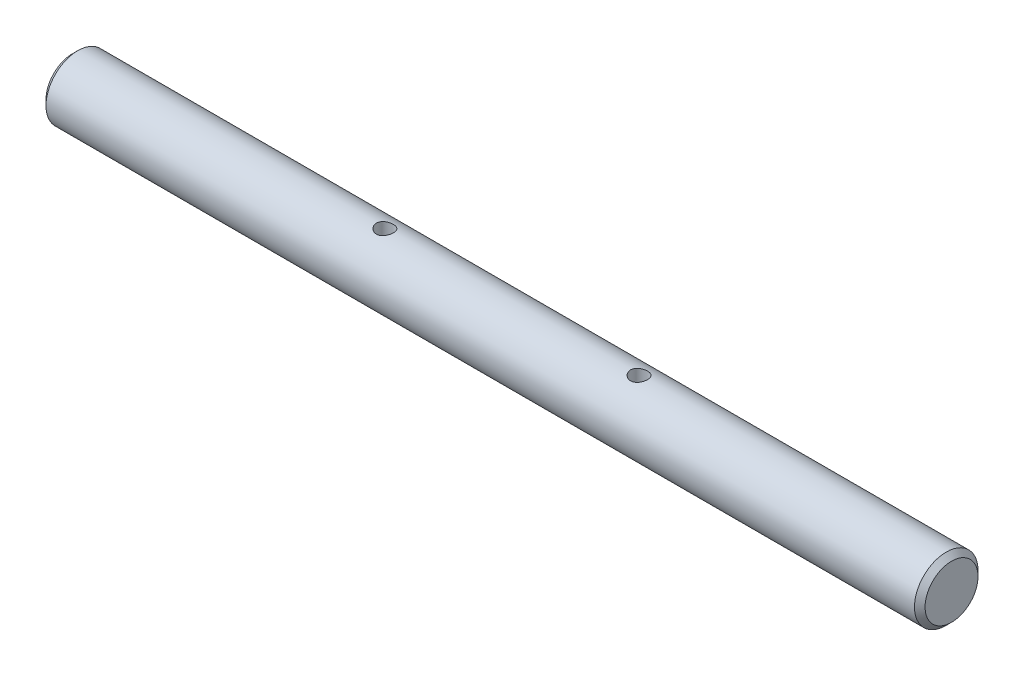
ISO-10303-21;
HEADER;
FILE_DESCRIPTION(('STEP AP214'),'2;1');
FILE_NAME('part.step','',(''),(''),'','','');
FILE_SCHEMA(('AUTOMOTIVE_DESIGN { 1 0 10303 214 1 1 1 1 }'));
ENDSEC;
DATA;
#1=APPLICATION_CONTEXT('core data for automotive mechanical design processes');
#2=APPLICATION_PROTOCOL_DEFINITION('international standard','automotive_design',2000,#1);
#3=PRODUCT_CONTEXT('',#1,'mechanical');
#4=PRODUCT('Part','Part','',(#3));
#5=PRODUCT_RELATED_PRODUCT_CATEGORY('part','',(#4));
#6=PRODUCT_DEFINITION_FORMATION('','',#4);
#7=PRODUCT_DEFINITION_CONTEXT('part definition',#1,'design');
#8=PRODUCT_DEFINITION('design','',#6,#7);
#9=PRODUCT_DEFINITION_SHAPE('','',#8);
#10=(LENGTH_UNIT() NAMED_UNIT(*) SI_UNIT(.MILLI.,.METRE.));
#11=(NAMED_UNIT(*) PLANE_ANGLE_UNIT() SI_UNIT($,.RADIAN.));
#12=(NAMED_UNIT(*) SI_UNIT($,.STERADIAN.) SOLID_ANGLE_UNIT());
#13=UNCERTAINTY_MEASURE_WITH_UNIT(LENGTH_MEASURE(1.E-05),#10,'distance_accuracy_value','');
#14=(GEOMETRIC_REPRESENTATION_CONTEXT(3) GLOBAL_UNCERTAINTY_ASSIGNED_CONTEXT((#13)) GLOBAL_UNIT_ASSIGNED_CONTEXT((#10,
#11,#12)) REPRESENTATION_CONTEXT('',''));
#15=CARTESIAN_POINT('',(0.,0.,0.));
#16=DIRECTION('',(0.,0.,1.));
#17=DIRECTION('',(1.,0.,0.));
#18=AXIS2_PLACEMENT_3D('',#15,#16,#17);
#19=CARTESIAN_POINT('',(-830.,-1.00783655742852E-13,0.));
#20=DIRECTION('',(-1.,0.,0.));
#21=DIRECTION('',(0.,-1.,0.));
#22=AXIS2_PLACEMENT_3D('',#19,#20,#21);
#23=PLANE('',#22);
#24=CARTESIAN_POINT('',(-830.,-1.00787433954253E-13,0.));
#25=DIRECTION('',(-1.,0.,0.));
#26=DIRECTION('',(0.,-1.,0.));
#27=AXIS2_PLACEMENT_3D('',#24,#25,#26);
#28=CIRCLE('',#27,25.);
#29=CARTESIAN_POINT('',(-830.,-25.0000000000001,0.));
#30=VERTEX_POINT('',#29);
#31=EDGE_CURVE('E74',#30,#30,#28,.T.);
#32=ORIENTED_EDGE('',*,*,#31,.T.);
#33=EDGE_LOOP('',(#32));
#34=FACE_BOUND('',#33,.T.);
#35=ADVANCED_FACE('F34',(#34),#23,.T.);
#36=CARTESIAN_POINT('',(0.,0.,0.));
#37=DIRECTION('',(1.,0.,0.));
#38=DIRECTION('',(0.,1.,0.));
#39=AXIS2_PLACEMENT_3D('',#36,#37,#38);
#40=CYLINDRICAL_SURFACE('',#39,29.9999999999999);
#41=CARTESIAN_POINT('',(-543.,29.9999999999999,0.));
#42=CARTESIAN_POINT('',(-543.000007553323,30.0000047930631,0.220578650093214));
#43=CARTESIAN_POINT('',(-542.990876275568,29.9975638847036,0.44107861860417));
#44=CARTESIAN_POINT('',(-542.954447702199,29.9878789889453,0.880527690255317));
#45=CARTESIAN_POINT('',(-542.927148719892,29.9806345555865,1.09947664749168));
#46=CARTESIAN_POINT('',(-542.854602364421,29.9615348022886,1.53421519571786));
#47=CARTESIAN_POINT('',(-542.809350811802,29.9496784086728,1.75000403887752));
#48=CARTESIAN_POINT('',(-542.701263997597,29.921676776969,2.17693220172065));
#49=CARTESIAN_POINT('',(-542.638422244539,29.9055299556574,2.38806977381499));
#50=CARTESIAN_POINT('',(-542.495793979561,29.8694188162847,2.8037988116442));
#51=CARTESIAN_POINT('',(-542.416036263869,29.8494609914199,3.00840073050495));
#52=CARTESIAN_POINT('',(-542.240098822965,29.8062369400105,3.41014305480076));
#53=CARTESIAN_POINT('',(-542.143912947016,29.7829694748769,3.60728063167393));
#54=CARTESIAN_POINT('',(-541.935888798767,29.7337577302114,3.99266560536456));
#55=CARTESIAN_POINT('',(-541.824056438443,29.7078144626914,4.18091632428779));
#56=CARTESIAN_POINT('',(-541.585441439478,29.6539125450335,4.54750659590857));
#57=CARTESIAN_POINT('',(-541.458651962993,29.6259529754042,4.72584156024369));
#58=CARTESIAN_POINT('',(-541.188217349944,29.5681624094275,5.07501132612926));
#59=CARTESIAN_POINT('',(-541.044275915808,29.5383045499936,5.24561225495415));
#60=CARTESIAN_POINT('',(-540.742764740162,29.4780857786046,5.57407686176042));
#61=CARTESIAN_POINT('',(-540.585200850615,29.4477250871441,5.7319459533309));
#62=CARTESIAN_POINT('',(-540.25732528101,29.3873016651862,6.0340910642144));
#63=CARTESIAN_POINT('',(-540.087006844738,29.3572391022952,6.17835978656734));
#64=CARTESIAN_POINT('',(-539.734853919675,29.2982717118577,6.45220041997699));
#65=CARTESIAN_POINT('',(-539.553023756569,29.2693664560243,6.58177780102014));
#66=CARTESIAN_POINT('',(-539.175657778869,29.2130229538655,6.82755230890048));
#67=CARTESIAN_POINT('',(-538.979937028577,29.1856194941862,6.94347370726029));
#68=CARTESIAN_POINT('',(-538.579109813293,29.133667102541,7.15832798081875));
#69=CARTESIAN_POINT('',(-538.374006782175,29.1091171376737,7.25726700947716));
#70=CARTESIAN_POINT('',(-537.955760833145,29.063608069803,7.43742733698708));
#71=CARTESIAN_POINT('',(-537.742617552373,29.0426491291001,7.51864783507406));
#72=CARTESIAN_POINT('',(-537.309834143432,29.0049801777022,7.66268056074757));
#73=CARTESIAN_POINT('',(-537.090194194343,28.9882700500102,7.72549329522533));
#74=CARTESIAN_POINT('',(-536.651066975735,28.9599569294659,7.83095203764014));
#75=CARTESIAN_POINT('',(-536.431688223242,28.9482471463235,7.874021348758));
#76=CARTESIAN_POINT('',(-535.989893894342,28.9297630127214,7.94166516963216));
#77=CARTESIAN_POINT('',(-535.76747840053,28.9229885283002,7.96624018138977));
#78=CARTESIAN_POINT('',(-535.321308138483,28.9145897070142,7.99667132852934));
#79=CARTESIAN_POINT('',(-535.097553584693,28.9129645665067,8.00253038485552));
#80=CARTESIAN_POINT('',(-534.650364903921,28.914914048328,7.99548370789009));
#81=CARTESIAN_POINT('',(-534.426930771811,28.918488586469,7.98257827841278));
#82=CARTESIAN_POINT('',(-533.988322683818,28.9305510183288,7.93874759581903));
#83=CARTESIAN_POINT('',(-533.773093003724,28.9388980708055,7.90833871941785));
#84=CARTESIAN_POINT('',(-533.345966238172,28.9601504503288,7.83015486647988));
#85=CARTESIAN_POINT('',(-533.134070298399,28.9730573101535,7.78237405021198));
#86=CARTESIAN_POINT('',(-532.715204658771,29.0030456839357,7.66985820348015));
#87=CARTESIAN_POINT('',(-532.50823348395,29.0201259302454,7.60512832079342));
#88=CARTESIAN_POINT('',(-532.100449141454,29.0579792646432,7.45919034864228));
#89=CARTESIAN_POINT('',(-531.899638320484,29.078753740011,7.37797606722881));
#90=CARTESIAN_POINT('',(-531.503395524887,29.1236513457428,7.19871913874454));
#91=CARTESIAN_POINT('',(-531.308046081132,29.1478085210255,7.10050264502406));
#92=CARTESIAN_POINT('',(-530.926218779983,29.1986278932287,6.88854155962731));
#93=CARTESIAN_POINT('',(-530.739744003235,29.2252909505938,6.77479162811635));
#94=CARTESIAN_POINT('',(-530.376894599154,29.2803849259845,6.53257063041096));
#95=CARTESIAN_POINT('',(-530.200519908834,29.3088158329832,6.40409965603455));
#96=CARTESIAN_POINT('',(-529.858945979402,29.3666834698069,6.1332757301041));
#97=CARTESIAN_POINT('',(-529.693746987892,29.396120221895,5.9909224711538));
#98=CARTESIAN_POINT('',(-529.37030991152,29.4561934526222,5.68834118264574));
#99=CARTESIAN_POINT('',(-529.212478402024,29.4868375912611,5.52767975596189));
#100=CARTESIAN_POINT('',(-528.910915857331,29.5475063444804,5.19361849033304));
#101=CARTESIAN_POINT('',(-528.767180199215,29.5775311596078,5.02022286058351));
#102=CARTESIAN_POINT('',(-528.49467348833,29.6361528289598,4.66169990972505));
#103=CARTESIAN_POINT('',(-528.365908684101,29.6647490841117,4.47656773947668));
#104=CARTESIAN_POINT('',(-528.124379419675,29.7196959795787,4.09592807500765));
#105=CARTESIAN_POINT('',(-528.011608745967,29.7460474903498,3.90042465066477));
#106=CARTESIAN_POINT('',(-527.802355705316,29.7959007840005,3.49933186872616));
#107=CARTESIAN_POINT('',(-527.705953499575,29.8193883919425,3.29369889679414));
#108=CARTESIAN_POINT('',(-527.530898311044,29.8626905301684,2.87472517640497));
#109=CARTESIAN_POINT('',(-527.452238694258,29.8825064328148,2.66138734354224));
#110=CARTESIAN_POINT('',(-527.313282191757,29.9179062239642,2.22846399646933));
#111=CARTESIAN_POINT('',(-527.252985541727,29.9334900581487,2.00887840210939));
#112=CARTESIAN_POINT('',(-527.151287704939,29.9599711289041,1.56509795980917));
#113=CARTESIAN_POINT('',(-527.109885983363,29.9708684981237,1.34090324251683));
#114=CARTESIAN_POINT('',(-527.047270611823,29.9874143846418,0.896138562380327));
#115=CARTESIAN_POINT('',(-527.025508257978,29.9932054526485,0.675651013960197));
#116=CARTESIAN_POINT('',(-527.000345785102,29.9999053106139,0.233557953828592));
#117=CARTESIAN_POINT('',(-526.996945328906,30.0008141902205,0.0119524627197998));
#118=CARTESIAN_POINT('',(-527.008535815913,29.9977244037235,-0.430720407408145));
#119=CARTESIAN_POINT('',(-527.023525010447,29.9937262042333,-0.651787835588864));
#120=CARTESIAN_POINT('',(-527.071759627023,29.980934868282,-1.09178012606594));
#121=CARTESIAN_POINT('',(-527.105004961317,29.9721417548675,-1.31070499865522));
#122=CARTESIAN_POINT('',(-527.18872760904,29.950198285482,-1.74104501006522));
#123=CARTESIAN_POINT('',(-527.238895168966,29.9371263701291,-1.95252453742266));
#124=CARTESIAN_POINT('',(-527.356189700937,29.9069327349072,-2.37050563135289));
#125=CARTESIAN_POINT('',(-527.423322397106,29.8898096482768,-2.57700549194869));
#126=CARTESIAN_POINT('',(-527.57399324363,29.8519725314259,-2.98352164314602));
#127=CARTESIAN_POINT('',(-527.657526861536,29.8312594934854,-3.18353970726185));
#128=CARTESIAN_POINT('',(-527.840422138302,29.7867703566691,-3.57593636687398));
#129=CARTESIAN_POINT('',(-527.939789738905,29.7629931085836,-3.7683120605604));
#130=CARTESIAN_POINT('',(-528.155684098607,29.7125131434757,-4.14775826908591));
#131=CARTESIAN_POINT('',(-528.27250405253,29.6857629669211,-4.33465565508763));
#132=CARTESIAN_POINT('',(-528.521056276824,29.6304241052244,-4.69805995168513));
#133=CARTESIAN_POINT('',(-528.652793710511,29.6018347849962,-4.87456323229005));
#134=CARTESIAN_POINT('',(-528.930268533944,29.5435821401273,-5.21600943606092));
#135=CARTESIAN_POINT('',(-529.076005994551,29.513918810051,-5.38095230070628));
#136=CARTESIAN_POINT('',(-529.380541778826,29.4543038977113,-5.69824941655318));
#137=CARTESIAN_POINT('',(-529.539340280911,29.4243523115152,-5.85060349573134));
#138=CARTESIAN_POINT('',(-529.873690533161,29.3641150587542,-6.14590109448038));
#139=CARTESIAN_POINT('',(-530.049590195041,29.3338440974521,-6.28845400395979));
#140=CARTESIAN_POINT('',(-530.412928178699,29.2747180395518,-6.55819708628241));
#141=CARTESIAN_POINT('',(-530.600362527778,29.2458624615621,-6.68539250423749));
#142=CARTESIAN_POINT('',(-530.985655529724,29.1903856403261,-6.92360848323256));
#143=CARTESIAN_POINT('',(-531.183517890223,29.1637652006159,-7.03462323776114));
#144=CARTESIAN_POINT('',(-531.588187615959,29.1135738024768,-7.23954079101897));
#145=CARTESIAN_POINT('',(-531.794991325833,29.0900016133139,-7.33345050222152));
#146=CARTESIAN_POINT('',(-532.215027097304,29.0467327109947,-7.50299524013634));
#147=CARTESIAN_POINT('',(-532.428217809395,29.0270155048397,-7.57872741686942));
#148=CARTESIAN_POINT('',(-532.860496234593,28.9919142970286,-7.71191627952164));
#149=CARTESIAN_POINT('',(-533.079581650357,28.9765286332903,-7.7693799764461));
#150=CARTESIAN_POINT('',(-533.522107002907,28.9505679624227,-7.86556421887171));
#151=CARTESIAN_POINT('',(-533.745546840439,28.9399928457767,-7.90428519106982));
#152=CARTESIAN_POINT('',(-534.195087053411,28.9239941302562,-7.96263042731839));
#153=CARTESIAN_POINT('',(-534.42118735359,28.9185703860098,-7.98225523026333));
#154=CARTESIAN_POINT('',(-534.866857543738,28.9131408569838,-8.00189864511028));
#155=CARTESIAN_POINT('',(-535.086398138443,28.9129630489632,-8.00253976703751));
#156=CARTESIAN_POINT('',(-535.52473629084,28.9175953549483,-7.98578455758696));
#157=CARTESIAN_POINT('',(-535.743533855862,28.9224054196028,-7.96838840467462));
#158=CARTESIAN_POINT('',(-536.178792254487,28.9368664188398,-7.91571252441195));
#159=CARTESIAN_POINT('',(-536.395253178247,28.946517165962,-7.88043348959385));
#160=CARTESIAN_POINT('',(-536.824308787774,28.9703679303138,-7.79229507779217));
#161=CARTESIAN_POINT('',(-537.03690345392,28.9845679706249,-7.73943561161182));
#162=CARTESIAN_POINT('',(-537.455084969714,29.0169661243447,-7.61706278409508));
#163=CARTESIAN_POINT('',(-537.660714037424,29.0351316225569,-7.54768488472809));
#164=CARTESIAN_POINT('',(-538.065428333991,29.0750112653576,-7.39257259459486));
#165=CARTESIAN_POINT('',(-538.264511327991,29.0967266070744,-7.30683268436169));
#166=CARTESIAN_POINT('',(-538.654777181823,29.1430927062824,-7.11965152069293));
#167=CARTESIAN_POINT('',(-538.845960565115,29.1677432688521,-7.01821130974532));
#168=CARTESIAN_POINT('',(-539.219266797118,29.2193091692492,-6.80033085633948));
#169=CARTESIAN_POINT('',(-539.401389176814,29.2462246241177,-6.68388983853061));
#170=CARTESIAN_POINT('',(-539.760675952243,29.3024167838013,-6.43314499527035));
#171=CARTESIAN_POINT('',(-539.93753679842,29.331739662869,-6.29841639334599));
#172=CARTESIAN_POINT('',(-540.279358350729,29.3912111016277,-6.0147900741576));
#173=CARTESIAN_POINT('',(-540.444318864322,29.421359674667,-5.86589212773193));
#174=CARTESIAN_POINT('',(-540.761326901703,29.481666538172,-5.5548566642167));
#175=CARTESIAN_POINT('',(-540.913371247325,29.5118248292069,-5.39271590772657));
#176=CARTESIAN_POINT('',(-541.203508850821,29.5713266043131,-5.05626570232199));
#177=CARTESIAN_POINT('',(-541.341602386873,29.6006701046228,-4.8819564961639));
#178=CARTESIAN_POINT('',(-541.605744930056,29.6583696669232,-4.5183743706445));
#179=CARTESIAN_POINT('',(-541.731468492063,29.6866906027376,-4.32885920866293));
#180=CARTESIAN_POINT('',(-541.966420698044,29.7408465182511,-3.93962503807924));
#181=CARTESIAN_POINT('',(-542.075655374307,29.7666824058182,-3.73990979703194));
#182=CARTESIAN_POINT('',(-542.276807268399,29.8151368355484,-3.33163997046083));
#183=CARTESIAN_POINT('',(-542.368730747922,29.8377565403201,-3.12308861464556));
#184=CARTESIAN_POINT('',(-542.534540990601,29.879138125294,-2.69863720135613));
#185=CARTESIAN_POINT('',(-542.608430175326,29.8979005233855,-2.48273813494225));
#186=CARTESIAN_POINT('',(-542.78102274388,29.9421638772525,-1.89769086313884));
#187=CARTESIAN_POINT('',(-542.862983485227,29.963707790729,-1.5231488606223));
#188=CARTESIAN_POINT('',(-542.972462872424,29.9926209941335,-0.765658396861665));
#189=CARTESIAN_POINT('',(-542.999986894752,29.9999916838872,-0.382710769582186));
#190=CARTESIAN_POINT('',(-543.,29.9999999999999,0.));
#191=B_SPLINE_CURVE_WITH_KNOTS('',3,(#41,#42,#43,#44,#45,#46,#47,#48,#49,#50,#51,#52,#53,#54,
#55,#56,#57,#58,#59,#60,#61,#62,#63,#64,#65,#66,#67,#68,#69,#70,#71,#72,#73,#74,#75,#76,#77,#78,
#79,#80,#81,#82,#83,#84,#85,#86,#87,#88,#89,#90,#91,#92,#93,#94,#95,#96,#97,#98,#99,#100,#101,
#102,#103,#104,#105,#106,#107,#108,#109,#110,#111,#112,#113,#114,#115,#116,#117,#118,#119,#120,
#121,#122,#123,#124,#125,#126,#127,#128,#129,#130,#131,#132,#133,#134,#135,#136,#137,#138,#139,
#140,#141,#142,#143,#144,#145,#146,#147,#148,#149,#150,#151,#152,#153,#154,#155,#156,#157,#158,
#159,#160,#161,#162,#163,#164,#165,#166,#167,#168,#169,#170,#171,#172,#173,#174,#175,#176,#177,
#178,#179,#180,#181,#182,#183,#184,#185,#186,#187,#188,#189,#190),.UNSPECIFIED.,.T.,.F.,(4,2,2,
2,2,2,2,2,2,2,2,2,2,2,2,2,2,2,2,2,2,2,2,2,2,2,2,2,2,2,2,2,2,2,2,2,2,2,2,2,2,2,2,2,2,2,2,2,2,2,2,
2,2,2,2,2,2,2,2,2,2,2,2,2,2,2,2,2,2,2,2,2,2,2,4),(0.,0.661398233048699,1.32285787901007,
1.98447160679911,2.64632981853879,3.30707025741839,3.96805862339446,4.62879790814604,
5.28984043791275,5.96466429305824,6.63919968283214,7.31409494326421,7.98873809084509,
8.67525864701602,9.36152991903398,10.0478321997126,10.7341155800347,11.4049041084224,
12.0756744285579,12.7463400584225,13.4169948297136,14.068810305095,14.7208450969064,
15.3726820816985,16.0247643672578,16.6839572310015,17.3433772745753,18.0027932054409,
18.6622237411095,19.3433032278853,20.0241585935002,20.7052971222627,21.3861703085459,
22.0702873433142,22.7541481595408,23.4380177526714,24.1218679878248,24.7859608021704,
25.4500414222672,26.114058899934,26.7780731860634,27.4305389784524,28.0832252107559,
28.7357313242727,29.3884828715509,30.0537853451988,30.7193188047654,31.3848556331206,
32.0504015544074,32.7348662000306,33.419096412167,34.1035715623455,34.7877694864008,
35.4682249525509,36.1484189600498,36.8285974815203,37.5087568077749,38.1665868538479,
38.824410391243,39.4822084557194,40.1400098576773,40.7925921674684,41.4453950060203,
42.0981545175428,42.7509477819647,43.422948394753,44.0949598776946,44.7671362404436,
45.4392991973377,46.1260127490718,46.8124744616758,47.4986873928573,48.1848081315288,
49.3324678454551,50.480014204377),.UNSPECIFIED.);
#192=CARTESIAN_POINT('',(-543.,29.9999999999999,0.));
#193=VERTEX_POINT('',#192);
#194=EDGE_CURVE('E11',#193,#193,#191,.T.);
#195=ORIENTED_EDGE('',*,*,#194,.F.);
#196=EDGE_LOOP('',(#195));
#197=FACE_BOUND('',#196,.T.);
#198=CARTESIAN_POINT('',(-303.,29.9999999999999,0.));
#199=CARTESIAN_POINT('',(-303.000007553323,30.0000047930631,0.220578650093209));
#200=CARTESIAN_POINT('',(-302.990876275568,29.9975638847036,0.441078618604161));
#201=CARTESIAN_POINT('',(-302.954447702199,29.9878789889453,0.880527690255309));
#202=CARTESIAN_POINT('',(-302.927148719892,29.9806345555865,1.09947664749168));
#203=CARTESIAN_POINT('',(-302.854602364421,29.9615348022886,1.53421519571786));
#204=CARTESIAN_POINT('',(-302.809350811802,29.9496784086728,1.75000403887751));
#205=CARTESIAN_POINT('',(-302.701263997597,29.921676776969,2.17693220172063));
#206=CARTESIAN_POINT('',(-302.638422244539,29.9055299556574,2.38806977381498));
#207=CARTESIAN_POINT('',(-302.495793979561,29.8694188162847,2.8037988116442));
#208=CARTESIAN_POINT('',(-302.416036263869,29.84946099142,3.00840073050495));
#209=CARTESIAN_POINT('',(-302.240098822965,29.8062369400105,3.41014305480077));
#210=CARTESIAN_POINT('',(-302.143912947016,29.782969474877,3.60728063167397));
#211=CARTESIAN_POINT('',(-301.935888798767,29.7337577302114,3.99266560536459));
#212=CARTESIAN_POINT('',(-301.824056438443,29.7078144626915,4.18091632428781));
#213=CARTESIAN_POINT('',(-301.585441439479,29.6539125450336,4.54750659590858));
#214=CARTESIAN_POINT('',(-301.458651962993,29.6259529754042,4.72584156024371));
#215=CARTESIAN_POINT('',(-301.188217349944,29.5681624094276,5.07501132612925));
#216=CARTESIAN_POINT('',(-301.044275915808,29.5383045499936,5.2456122549541));
#217=CARTESIAN_POINT('',(-300.742764740162,29.4780857786047,5.57407686176036));
#218=CARTESIAN_POINT('',(-300.585200850615,29.4477250871442,5.73194595333085));
#219=CARTESIAN_POINT('',(-300.25732528101,29.3873016651862,6.03409106421435));
#220=CARTESIAN_POINT('',(-300.087006844738,29.3572391022953,6.17835978656728));
#221=CARTESIAN_POINT('',(-299.734853919675,29.2982717118577,6.45220041997692));
#222=CARTESIAN_POINT('',(-299.553023756569,29.2693664560244,6.58177780102009));
#223=CARTESIAN_POINT('',(-299.175657778869,29.2130229538655,6.82755230890045));
#224=CARTESIAN_POINT('',(-298.979937028577,29.1856194941862,6.94347370726026));
#225=CARTESIAN_POINT('',(-298.579109813293,29.133667102541,7.15832798081871));
#226=CARTESIAN_POINT('',(-298.374006782175,29.1091171376738,7.2572670094771));
#227=CARTESIAN_POINT('',(-297.955760833145,29.063608069803,7.43742733698702));
#228=CARTESIAN_POINT('',(-297.742617552373,29.0426491291001,7.51864783507401));
#229=CARTESIAN_POINT('',(-297.309834143432,29.0049801777023,7.66268056074754));
#230=CARTESIAN_POINT('',(-297.090194194343,28.9882700500102,7.72549329522528));
#231=CARTESIAN_POINT('',(-296.651066975735,28.9599569294659,7.83095203764009));
#232=CARTESIAN_POINT('',(-296.431688223242,28.9482471463235,7.87402134875795));
#233=CARTESIAN_POINT('',(-295.989893894342,28.9297630127214,7.94166516963212));
#234=CARTESIAN_POINT('',(-295.76747840053,28.9229885283002,7.96624018138973));
#235=CARTESIAN_POINT('',(-295.321308138483,28.9145897070142,7.99667132852931));
#236=CARTESIAN_POINT('',(-295.097553584693,28.9129645665068,8.00253038485549));
#237=CARTESIAN_POINT('',(-294.650364903921,28.914914048328,7.99548370789006));
#238=CARTESIAN_POINT('',(-294.426930771811,28.9184885864691,7.98257827841276));
#239=CARTESIAN_POINT('',(-293.988322683817,28.9305510183288,7.938747595819));
#240=CARTESIAN_POINT('',(-293.773093003724,28.9388980708056,7.9083387194178));
#241=CARTESIAN_POINT('',(-293.345966238172,28.9601504503288,7.83015486647984));
#242=CARTESIAN_POINT('',(-293.134070298399,28.9730573101536,7.78237405021196));
#243=CARTESIAN_POINT('',(-292.715204658771,29.0030456839357,7.66985820348014));
#244=CARTESIAN_POINT('',(-292.50823348395,29.0201259302454,7.60512832079339));
#245=CARTESIAN_POINT('',(-292.100449141454,29.0579792646432,7.45919034864225));
#246=CARTESIAN_POINT('',(-291.899638320484,29.0787537400111,7.37797606722878));
#247=CARTESIAN_POINT('',(-291.503395524887,29.1236513457428,7.19871913874452));
#248=CARTESIAN_POINT('',(-291.308046081132,29.1478085210256,7.10050264502404));
#249=CARTESIAN_POINT('',(-290.926218779983,29.1986278932287,6.88854155962729));
#250=CARTESIAN_POINT('',(-290.739744003236,29.2252909505938,6.77479162811634));
#251=CARTESIAN_POINT('',(-290.376894599154,29.2803849259845,6.53257063041098));
#252=CARTESIAN_POINT('',(-290.200519908834,29.3088158329832,6.40409965603459));
#253=CARTESIAN_POINT('',(-289.858945979402,29.3666834698069,6.13327573010412));
#254=CARTESIAN_POINT('',(-289.693746987892,29.3961202218951,5.99092247115379));
#255=CARTESIAN_POINT('',(-289.37030991152,29.4561934526223,5.68834118264569));
#256=CARTESIAN_POINT('',(-289.212478402024,29.4868375912611,5.52767975596185));
#257=CARTESIAN_POINT('',(-288.910915857331,29.5475063444804,5.19361849033301));
#258=CARTESIAN_POINT('',(-288.767180199215,29.5775311596079,5.02022286058347));
#259=CARTESIAN_POINT('',(-288.49467348833,29.6361528289598,4.661699909725));
#260=CARTESIAN_POINT('',(-288.365908684101,29.6647490841117,4.47656773947662));
#261=CARTESIAN_POINT('',(-288.124379419675,29.7196959795787,4.09592807500758));
#262=CARTESIAN_POINT('',(-288.011608745967,29.7460474903498,3.90042465066471));
#263=CARTESIAN_POINT('',(-287.802355705316,29.7959007840005,3.49933186872611));
#264=CARTESIAN_POINT('',(-287.705953499574,29.8193883919426,3.2936988967941));
#265=CARTESIAN_POINT('',(-287.530898311044,29.8626905301684,2.87472517640491));
#266=CARTESIAN_POINT('',(-287.452238694258,29.8825064328148,2.66138734354217));
#267=CARTESIAN_POINT('',(-287.313282191757,29.9179062239642,2.22846399646924));
#268=CARTESIAN_POINT('',(-287.252985541727,29.9334900581487,2.00887840210932));
#269=CARTESIAN_POINT('',(-287.151287704939,29.9599711289041,1.56509795980909));
#270=CARTESIAN_POINT('',(-287.109885983363,29.9708684981237,1.34090324251673));
#271=CARTESIAN_POINT('',(-287.047270611823,29.9874143846418,0.896138562380225));
#272=CARTESIAN_POINT('',(-287.025508257978,29.9932054526485,0.675651013960099));
#273=CARTESIAN_POINT('',(-287.000345785102,29.999905310614,0.233557953828505));
#274=CARTESIAN_POINT('',(-286.996945328906,30.0008141902206,0.011952462719719));
#275=CARTESIAN_POINT('',(-287.008535815913,29.9977244037235,-0.43072040740822));
#276=CARTESIAN_POINT('',(-287.023525010447,29.9937262042333,-0.651787835588939));
#277=CARTESIAN_POINT('',(-287.071759627023,29.980934868282,-1.091780126066));
#278=CARTESIAN_POINT('',(-287.105004961317,29.9721417548675,-1.31070499865528));
#279=CARTESIAN_POINT('',(-287.18872760904,29.950198285482,-1.74104501006528));
#280=CARTESIAN_POINT('',(-287.238895168966,29.9371263701292,-1.95252453742272));
#281=CARTESIAN_POINT('',(-287.356189700937,29.9069327349072,-2.37050563135296));
#282=CARTESIAN_POINT('',(-287.423322397106,29.8898096482768,-2.57700549194876));
#283=CARTESIAN_POINT('',(-287.57399324363,29.8519725314259,-2.98352164314609));
#284=CARTESIAN_POINT('',(-287.657526861536,29.8312594934854,-3.18353970726192));
#285=CARTESIAN_POINT('',(-287.840422138302,29.7867703566692,-3.57593636687404));
#286=CARTESIAN_POINT('',(-287.939789738905,29.7629931085836,-3.76831206056044));
#287=CARTESIAN_POINT('',(-288.155684098607,29.7125131434758,-4.14775826908596));
#288=CARTESIAN_POINT('',(-288.27250405253,29.6857629669212,-4.3346556550877));
#289=CARTESIAN_POINT('',(-288.521056276824,29.6304241052244,-4.6980599516852));
#290=CARTESIAN_POINT('',(-288.652793710511,29.6018347849962,-4.8745632322901));
#291=CARTESIAN_POINT('',(-288.930268533944,29.5435821401273,-5.21600943606096));
#292=CARTESIAN_POINT('',(-289.076005994551,29.513918810051,-5.38095230070633));
#293=CARTESIAN_POINT('',(-289.380541778826,29.4543038977114,-5.69824941655322));
#294=CARTESIAN_POINT('',(-289.539340280911,29.4243523115152,-5.85060349573138));
#295=CARTESIAN_POINT('',(-289.873690533161,29.3641150587542,-6.14590109448041));
#296=CARTESIAN_POINT('',(-290.049590195041,29.3338440974521,-6.28845400395982));
#297=CARTESIAN_POINT('',(-290.412928178699,29.2747180395519,-6.55819708628244));
#298=CARTESIAN_POINT('',(-290.600362527778,29.2458624615621,-6.68539250423752));
#299=CARTESIAN_POINT('',(-290.985655529724,29.1903856403261,-6.92360848323258));
#300=CARTESIAN_POINT('',(-291.183517890223,29.1637652006159,-7.03462323776116));
#301=CARTESIAN_POINT('',(-291.588187615959,29.1135738024768,-7.23954079101901));
#302=CARTESIAN_POINT('',(-291.794991325833,29.0900016133139,-7.33345050222158));
#303=CARTESIAN_POINT('',(-292.215027097304,29.0467327109948,-7.50299524013636));
#304=CARTESIAN_POINT('',(-292.428217809395,29.0270155048397,-7.57872741686939));
#305=CARTESIAN_POINT('',(-292.860496234593,28.9919142970287,-7.71191627952159));
#306=CARTESIAN_POINT('',(-293.079581650357,28.9765286332904,-7.76937997644607));
#307=CARTESIAN_POINT('',(-293.522107002907,28.9505679624227,-7.86556421887172));
#308=CARTESIAN_POINT('',(-293.745546840439,28.9399928457767,-7.90428519106985));
#309=CARTESIAN_POINT('',(-294.195087053411,28.9239941302562,-7.96263042731842));
#310=CARTESIAN_POINT('',(-294.42118735359,28.9185703860098,-7.98225523026337));
#311=CARTESIAN_POINT('',(-294.866857543738,28.9131408569839,-8.00189864511031));
#312=CARTESIAN_POINT('',(-295.086398138443,28.9129630489632,-8.00253976703754));
#313=CARTESIAN_POINT('',(-295.52473629084,28.9175953549483,-7.98578455758698));
#314=CARTESIAN_POINT('',(-295.743533855863,28.9224054196028,-7.96838840467465));
#315=CARTESIAN_POINT('',(-296.178792254487,28.9368664188398,-7.91571252441196));
#316=CARTESIAN_POINT('',(-296.395253178247,28.946517165962,-7.88043348959385));
#317=CARTESIAN_POINT('',(-296.824308787774,28.9703679303138,-7.79229507779217));
#318=CARTESIAN_POINT('',(-297.03690345392,28.9845679706249,-7.73943561161182));
#319=CARTESIAN_POINT('',(-297.455084969714,29.0169661243448,-7.61706278409507));
#320=CARTESIAN_POINT('',(-297.660714037424,29.035131622557,-7.54768488472807));
#321=CARTESIAN_POINT('',(-298.065428333992,29.0750112653576,-7.39257259459483));
#322=CARTESIAN_POINT('',(-298.264511327992,29.0967266070745,-7.30683268436168));
#323=CARTESIAN_POINT('',(-298.654777181823,29.1430927062824,-7.11965152069297));
#324=CARTESIAN_POINT('',(-298.845960565115,29.1677432688521,-7.01821130974539));
#325=CARTESIAN_POINT('',(-299.219266797118,29.2193091692492,-6.80033085633955));
#326=CARTESIAN_POINT('',(-299.401389176814,29.2462246241177,-6.68388983853063));
#327=CARTESIAN_POINT('',(-299.760675952243,29.3024167838014,-6.43314499527036));
#328=CARTESIAN_POINT('',(-299.93753679842,29.3317396628691,-6.29841639334603));
#329=CARTESIAN_POINT('',(-300.279358350729,29.3912111016277,-6.01479007415766));
#330=CARTESIAN_POINT('',(-300.444318864322,29.421359674667,-5.86589212773197));
#331=CARTESIAN_POINT('',(-300.761326901703,29.481666538172,-5.55485666421671));
#332=CARTESIAN_POINT('',(-300.913371247325,29.511824829207,-5.39271590772655));
#333=CARTESIAN_POINT('',(-301.203508850821,29.5713266043131,-5.05626570232196));
#334=CARTESIAN_POINT('',(-301.341602386873,29.6006701046228,-4.88195649616388));
#335=CARTESIAN_POINT('',(-301.605744930056,29.6583696669232,-4.5183743706445));
#336=CARTESIAN_POINT('',(-301.731468492063,29.6866906027377,-4.32885920866294));
#337=CARTESIAN_POINT('',(-301.966420698044,29.7408465182511,-3.93962503807924));
#338=CARTESIAN_POINT('',(-302.075655374307,29.7666824058183,-3.73990979703192));
#339=CARTESIAN_POINT('',(-302.276807268399,29.8151368355484,-3.33163997046078));
#340=CARTESIAN_POINT('',(-302.368730747922,29.8377565403201,-3.12308861464549));
#341=CARTESIAN_POINT('',(-302.534540990601,29.879138125294,-2.69863720135607));
#342=CARTESIAN_POINT('',(-302.608430175326,29.8979005233856,-2.48273813494222));
#343=CARTESIAN_POINT('',(-302.78102274388,29.9421638772526,-1.89769086313883));
#344=CARTESIAN_POINT('',(-302.862983485227,29.963707790729,-1.52314886062228));
#345=CARTESIAN_POINT('',(-302.972462872424,29.9926209941336,-0.76565839686165));
#346=CARTESIAN_POINT('',(-302.999986894752,29.9999916838872,-0.38271076958218));
#347=CARTESIAN_POINT('',(-303.,29.9999999999999,0.));
#348=B_SPLINE_CURVE_WITH_KNOTS('',3,(#198,#199,#200,#201,#202,#203,#204,#205,#206,#207,#208,
#209,#210,#211,#212,#213,#214,#215,#216,#217,#218,#219,#220,#221,#222,#223,#224,#225,#226,#227,
#228,#229,#230,#231,#232,#233,#234,#235,#236,#237,#238,#239,#240,#241,#242,#243,#244,#245,#246,
#247,#248,#249,#250,#251,#252,#253,#254,#255,#256,#257,#258,#259,#260,#261,#262,#263,#264,#265,
#266,#267,#268,#269,#270,#271,#272,#273,#274,#275,#276,#277,#278,#279,#280,#281,#282,#283,#284,
#285,#286,#287,#288,#289,#290,#291,#292,#293,#294,#295,#296,#297,#298,#299,#300,#301,#302,#303,
#304,#305,#306,#307,#308,#309,#310,#311,#312,#313,#314,#315,#316,#317,#318,#319,#320,#321,#322,
#323,#324,#325,#326,#327,#328,#329,#330,#331,#332,#333,#334,#335,#336,#337,#338,#339,#340,#341,
#342,#343,#344,#345,#346,#347),.UNSPECIFIED.,.T.,.F.,(4,2,2,2,2,2,2,2,2,2,2,2,2,2,2,2,2,2,2,2,2,
2,2,2,2,2,2,2,2,2,2,2,2,2,2,2,2,2,2,2,2,2,2,2,2,2,2,2,2,2,2,2,2,2,2,2,2,2,2,2,2,2,2,2,2,2,2,2,2,
2,2,2,2,2,4),(0.,0.661398233048689,1.32285787901006,1.98447160679912,2.6463298185388,
3.30707025741842,3.96805862339448,4.62879790814604,5.28984043791278,5.96466429305822,
6.63919968283205,7.3140949432641,7.988738090845,8.67525864701594,9.36152991903388,
10.0478321997124,10.7341155800347,11.4049041084223,12.0756744285579,12.7463400584225,
13.4169948297136,14.068810305095,14.7208450969064,15.3726820816984,16.0247643672578,
16.6839572310015,17.3433772745751,18.0027932054408,18.6622237411095,19.3433032278853,
20.0241585935002,20.7052971222627,21.3861703085459,22.0702873433142,22.7541481595408,
23.4380177526714,24.1218679878249,24.7859608021705,25.4500414222673,26.114058899934,
26.7780731860634,27.4305389784524,28.0832252107559,28.7357313242726,29.3884828715509,
30.0537853451988,30.7193188047653,31.3848556331207,32.0504015544073,32.7348662000306,
33.4190964121671,34.1035715623456,34.7877694864008,35.4682249525506,36.1484189600496,
36.8285974815203,37.5087568077749,38.1665868538479,38.8244103912431,39.4822084557194,
40.1400098576776,40.7925921674686,41.4453950060204,42.0981545175428,42.7509477819646,
43.422948394753,44.0949598776946,44.7671362404437,45.4392991973377,46.1260127490718,
46.8124744616759,47.4986873928574,48.1848081315289,49.3324678454551,50.480014204377),.UNSPECIFIED.);
#349=CARTESIAN_POINT('',(-303.,29.9999999999999,0.));
#350=VERTEX_POINT('',#349);
#351=EDGE_CURVE('E47',#350,#350,#348,.T.);
#352=ORIENTED_EDGE('',*,*,#351,.F.);
#353=EDGE_LOOP('',(#352));
#354=FACE_BOUND('',#353,.T.);
#355=CARTESIAN_POINT('',(-825.,-1.00180280737661E-13,0.));
#356=DIRECTION('',(-1.,0.,0.));
#357=DIRECTION('',(0.,-1.,0.));
#358=AXIS2_PLACEMENT_3D('',#355,#356,#357);
#359=CIRCLE('',#358,29.9999999999999);
#360=CARTESIAN_POINT('',(-825.,-30.,0.));
#361=VERTEX_POINT('',#360);
#362=EDGE_CURVE('E71',#361,#361,#359,.F.);
#363=ORIENTED_EDGE('',*,*,#362,.T.);
#364=EDGE_LOOP('',(#363));
#365=FACE_BOUND('',#364,.T.);
#366=CARTESIAN_POINT('',(-5.00000000000002,0.,0.));
#367=DIRECTION('',(1.,0.,0.));
#368=DIRECTION('',(0.,1.,0.));
#369=AXIS2_PLACEMENT_3D('',#366,#367,#368);
#370=CIRCLE('',#369,29.9999999999999);
#371=CARTESIAN_POINT('',(-5.00000000000003,29.9999999999999,0.));
#372=VERTEX_POINT('',#371);
#373=EDGE_CURVE('E66',#372,#372,#370,.F.);
#374=ORIENTED_EDGE('',*,*,#373,.T.);
#375=EDGE_LOOP('',(#374));
#376=FACE_BOUND('',#375,.T.);
#377=ADVANCED_FACE('F84',(#197,#354,#365,#376),#40,.T.);
#378=CARTESIAN_POINT('',(0.,29.9999999999999,0.));
#379=DIRECTION('',(1.,0.,0.));
#380=DIRECTION('',(0.,1.,0.));
#381=AXIS2_PLACEMENT_3D('',#378,#379,#380);
#382=PLANE('',#381);
#383=CARTESIAN_POINT('',(0.,0.,0.));
#384=DIRECTION('',(1.,0.,0.));
#385=DIRECTION('',(0.,1.,0.));
#386=AXIS2_PLACEMENT_3D('',#383,#384,#385);
#387=CIRCLE('',#386,25.);
#388=CARTESIAN_POINT('',(0.,25.,0.));
#389=VERTEX_POINT('',#388);
#390=EDGE_CURVE('E77',#389,#389,#387,.T.);
#391=ORIENTED_EDGE('',*,*,#390,.T.);
#392=EDGE_LOOP('',(#391));
#393=FACE_BOUND('',#392,.T.);
#394=ADVANCED_FACE('F94',(#393),#382,.T.);
#395=CARTESIAN_POINT('',(-825.,-1.00180280737661E-13,0.));
#396=DIRECTION('',(1.,0.,0.));
#397=DIRECTION('',(0.,1.,0.));
#398=AXIS2_PLACEMENT_3D('',#395,#396,#397);
#399=CONICAL_SURFACE('',#398,29.9999999999999,0.785398163397451);
#400=ORIENTED_EDGE('',*,*,#31,.F.);
#401=EDGE_LOOP('',(#400));
#402=FACE_BOUND('',#401,.T.);
#403=ORIENTED_EDGE('',*,*,#362,.F.);
#404=EDGE_LOOP('',(#403));
#405=FACE_BOUND('',#404,.T.);
#406=ADVANCED_FACE('F96',(#402,#405),#399,.T.);
#407=CARTESIAN_POINT('',(0.,0.,0.));
#408=DIRECTION('',(-1.,0.,0.));
#409=DIRECTION('',(0.,-1.,0.));
#410=AXIS2_PLACEMENT_3D('',#407,#408,#409);
#411=CONICAL_SURFACE('',#410,25.,0.785398163397438);
#412=ORIENTED_EDGE('',*,*,#373,.F.);
#413=EDGE_LOOP('',(#412));
#414=FACE_BOUND('',#413,.T.);
#415=ORIENTED_EDGE('',*,*,#390,.F.);
#416=EDGE_LOOP('',(#415));
#417=FACE_BOUND('',#416,.T.);
#418=ADVANCED_FACE('F36',(#414,#417),#411,.T.);
#419=CARTESIAN_POINT('',(-295.,15.,0.));
#420=DIRECTION('',(0.,1.,0.));
#421=DIRECTION('',(0.,0.,1.));
#422=AXIS2_PLACEMENT_3D('',#419,#420,#421);
#423=CONICAL_SURFACE('',#422,8.00000000000001,1.02974425867665);
#424=CARTESIAN_POINT('',(-295.,10.1931150477795,0.));
#425=VERTEX_POINT('',#424);
#426=VERTEX_LOOP('',#425);
#427=FACE_BOUND('',#426,.T.);
#428=CARTESIAN_POINT('',(-295.,15.,0.));
#429=DIRECTION('',(0.,1.,0.));
#430=DIRECTION('',(0.,0.,1.));
#431=AXIS2_PLACEMENT_3D('',#428,#429,#430);
#432=CIRCLE('',#431,8.00000000000001);
#433=CARTESIAN_POINT('',(-295.,15.,8.00000000000004));
#434=VERTEX_POINT('',#433);
#435=EDGE_CURVE('E63',#434,#434,#432,.T.);
#436=ORIENTED_EDGE('',*,*,#435,.T.);
#437=EDGE_LOOP('',(#436));
#438=FACE_BOUND('',#437,.T.);
#439=ADVANCED_FACE('F91',(#427,#438),#423,.F.);
#440=CARTESIAN_POINT('',(-295.,30.,0.));
#441=DIRECTION('',(0.,1.,0.));
#442=DIRECTION('',(0.,0.,1.));
#443=AXIS2_PLACEMENT_3D('',#440,#441,#442);
#444=CYLINDRICAL_SURFACE('',#443,8.00000000000001);
#445=ORIENTED_EDGE('',*,*,#351,.T.);
#446=EDGE_LOOP('',(#445));
#447=FACE_BOUND('',#446,.T.);
#448=ORIENTED_EDGE('',*,*,#435,.F.);
#449=EDGE_LOOP('',(#448));
#450=FACE_BOUND('',#449,.T.);
#451=ADVANCED_FACE('F57',(#447,#450),#444,.F.);
#452=CARTESIAN_POINT('',(-535.,15.,0.));
#453=DIRECTION('',(0.,1.,0.));
#454=DIRECTION('',(0.,0.,1.));
#455=AXIS2_PLACEMENT_3D('',#452,#453,#454);
#456=CONICAL_SURFACE('',#455,8.00000000000001,1.02974425867665);
#457=CARTESIAN_POINT('',(-535.,10.1931150477795,0.));
#458=VERTEX_POINT('',#457);
#459=VERTEX_LOOP('',#458);
#460=FACE_BOUND('',#459,.T.);
#461=CARTESIAN_POINT('',(-535.,15.,0.));
#462=DIRECTION('',(0.,1.,0.));
#463=DIRECTION('',(0.,0.,1.));
#464=AXIS2_PLACEMENT_3D('',#461,#462,#463);
#465=CIRCLE('',#464,8.00000000000001);
#466=CARTESIAN_POINT('',(-535.,15.,8.00000000000007));
#467=VERTEX_POINT('',#466);
#468=EDGE_CURVE('E61',#467,#467,#465,.T.);
#469=ORIENTED_EDGE('',*,*,#468,.T.);
#470=EDGE_LOOP('',(#469));
#471=FACE_BOUND('',#470,.T.);
#472=ADVANCED_FACE('F53',(#460,#471),#456,.F.);
#473=CARTESIAN_POINT('',(-535.,30.,0.));
#474=DIRECTION('',(0.,1.,0.));
#475=DIRECTION('',(0.,0.,1.));
#476=AXIS2_PLACEMENT_3D('',#473,#474,#475);
#477=CYLINDRICAL_SURFACE('',#476,8.00000000000001);
#478=ORIENTED_EDGE('',*,*,#194,.T.);
#479=EDGE_LOOP('',(#478));
#480=FACE_BOUND('',#479,.T.);
#481=ORIENTED_EDGE('',*,*,#468,.F.);
#482=EDGE_LOOP('',(#481));
#483=FACE_BOUND('',#482,.T.);
#484=ADVANCED_FACE('F56',(#480,#483),#477,.F.);
#485=CLOSED_SHELL('',(#35,#377,#394,#406,#418,#439,#451,#472,#484));
#486=MANIFOLD_SOLID_BREP('B2',#485);
#487=ADVANCED_BREP_SHAPE_REPRESENTATION('',(#18,#486),#14);
#488=SHAPE_DEFINITION_REPRESENTATION(#9,#487);
ENDSEC;
END-ISO-10303-21;
